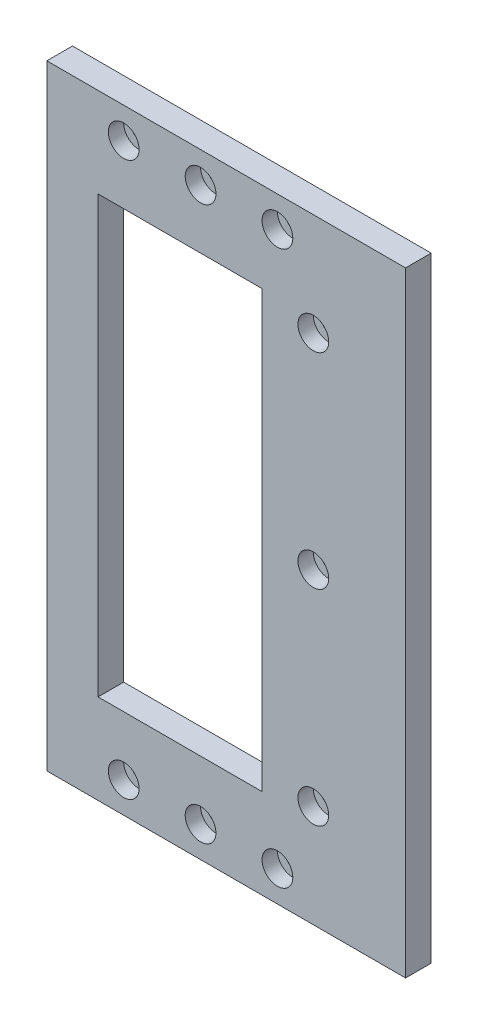
ISO-10303-21;
HEADER;
FILE_DESCRIPTION(('STEP AP214'),'2;1');
FILE_NAME('part.step','',(''),(''),'','','');
FILE_SCHEMA(('AUTOMOTIVE_DESIGN { 1 0 10303 214 1 1 1 1 }'));
ENDSEC;
DATA;
#1=APPLICATION_CONTEXT('core data for automotive mechanical design processes');
#2=APPLICATION_PROTOCOL_DEFINITION('international standard','automotive_design',2000,#1);
#3=PRODUCT_CONTEXT('',#1,'mechanical');
#4=PRODUCT('Part','Part','',(#3));
#5=PRODUCT_RELATED_PRODUCT_CATEGORY('part','',(#4));
#6=PRODUCT_DEFINITION_FORMATION('','',#4);
#7=PRODUCT_DEFINITION_CONTEXT('part definition',#1,'design');
#8=PRODUCT_DEFINITION('design','',#6,#7);
#9=PRODUCT_DEFINITION_SHAPE('','',#8);
#10=(LENGTH_UNIT() NAMED_UNIT(*) SI_UNIT(.MILLI.,.METRE.));
#11=(NAMED_UNIT(*) PLANE_ANGLE_UNIT() SI_UNIT($,.RADIAN.));
#12=(NAMED_UNIT(*) SI_UNIT($,.STERADIAN.) SOLID_ANGLE_UNIT());
#13=UNCERTAINTY_MEASURE_WITH_UNIT(LENGTH_MEASURE(1.E-05),#10,'distance_accuracy_value','');
#14=(GEOMETRIC_REPRESENTATION_CONTEXT(3) GLOBAL_UNCERTAINTY_ASSIGNED_CONTEXT((#13)) GLOBAL_UNIT_ASSIGNED_CONTEXT((#10,
#11,#12)) REPRESENTATION_CONTEXT('',''));
#15=CARTESIAN_POINT('',(0.,0.,0.));
#16=DIRECTION('',(0.,0.,1.));
#17=DIRECTION('',(1.,0.,0.));
#18=AXIS2_PLACEMENT_3D('',#15,#16,#17);
#19=CARTESIAN_POINT('',(-30.,60.,5.));
#20=DIRECTION('',(1.,0.,0.));
#21=DIRECTION('',(0.,0.,-1.));
#22=AXIS2_PLACEMENT_3D('',#19,#20,#21);
#23=PLANE('',#22);
#24=DIRECTION('',(0.,-1.,0.));
#25=VECTOR('',#24,1.);
#26=CARTESIAN_POINT('',(-30.,60.,0.));
#27=LINE('',#26,#25);
#28=CARTESIAN_POINT('',(-30.,60.,0.));
#29=VERTEX_POINT('',#28);
#30=CARTESIAN_POINT('',(-30.,-60.,0.));
#31=VERTEX_POINT('',#30);
#32=EDGE_CURVE('E240',#29,#31,#27,.T.);
#33=ORIENTED_EDGE('',*,*,#32,.T.);
#34=DIRECTION('',(0.,0.,-1.));
#35=VECTOR('',#34,1.);
#36=CARTESIAN_POINT('',(-30.,-60.,5.));
#37=LINE('',#36,#35);
#38=CARTESIAN_POINT('',(-30.,-60.,5.));
#39=VERTEX_POINT('',#38);
#40=EDGE_CURVE('E44',#39,#31,#37,.T.);
#41=ORIENTED_EDGE('',*,*,#40,.F.);
#42=DIRECTION('',(0.,-1.,0.));
#43=VECTOR('',#42,1.);
#44=CARTESIAN_POINT('',(-30.,60.,5.));
#45=LINE('',#44,#43);
#46=CARTESIAN_POINT('',(-30.,60.,5.));
#47=VERTEX_POINT('',#46);
#48=EDGE_CURVE('E230',#47,#39,#45,.T.);
#49=ORIENTED_EDGE('',*,*,#48,.F.);
#50=DIRECTION('',(0.,0.,-1.));
#51=VECTOR('',#50,1.);
#52=CARTESIAN_POINT('',(-30.,60.,5.));
#53=LINE('',#52,#51);
#54=EDGE_CURVE('E11',#47,#29,#53,.T.);
#55=ORIENTED_EDGE('',*,*,#54,.T.);
#56=EDGE_LOOP('',(#33,#41,#49,#55));
#57=FACE_BOUND('',#56,.T.);
#58=ADVANCED_FACE('F36',(#57),#23,.F.);
#59=CARTESIAN_POINT('',(0.,-60.,5.));
#60=DIRECTION('',(0.,1.,0.));
#61=DIRECTION('',(0.,0.,1.));
#62=AXIS2_PLACEMENT_3D('',#59,#60,#61);
#63=PLANE('',#62);
#64=DIRECTION('',(1.,0.,0.));
#65=VECTOR('',#64,1.);
#66=CARTESIAN_POINT('',(0.,-60.,0.));
#67=LINE('',#66,#65);
#68=CARTESIAN_POINT('',(40.,-60.,0.));
#69=VERTEX_POINT('',#68);
#70=EDGE_CURVE('E243',#31,#69,#67,.T.);
#71=ORIENTED_EDGE('',*,*,#70,.T.);
#72=DIRECTION('',(0.,0.,-1.));
#73=VECTOR('',#72,1.);
#74=CARTESIAN_POINT('',(40.,-60.,5.));
#75=LINE('',#74,#73);
#76=CARTESIAN_POINT('',(40.,-60.,5.));
#77=VERTEX_POINT('',#76);
#78=EDGE_CURVE('E252',#77,#69,#75,.T.);
#79=ORIENTED_EDGE('',*,*,#78,.F.);
#80=DIRECTION('',(-1.,0.,0.));
#81=VECTOR('',#80,1.);
#82=CARTESIAN_POINT('',(0.,-60.,5.));
#83=LINE('',#82,#81);
#84=EDGE_CURVE('E233',#77,#39,#83,.T.);
#85=ORIENTED_EDGE('',*,*,#84,.T.);
#86=ORIENTED_EDGE('',*,*,#40,.T.);
#87=EDGE_LOOP('',(#71,#79,#85,#86));
#88=FACE_BOUND('',#87,.T.);
#89=ADVANCED_FACE('F291',(#88),#63,.F.);
#90=CARTESIAN_POINT('',(40.,60.,5.));
#91=DIRECTION('',(1.,0.,0.));
#92=DIRECTION('',(0.,1.,0.));
#93=AXIS2_PLACEMENT_3D('',#90,#91,#92);
#94=PLANE('',#93);
#95=DIRECTION('',(0.,-1.,0.));
#96=VECTOR('',#95,1.);
#97=CARTESIAN_POINT('',(40.,60.,0.));
#98=LINE('',#97,#96);
#99=CARTESIAN_POINT('',(40.,60.,0.));
#100=VERTEX_POINT('',#99);
#101=EDGE_CURVE('E246',#100,#69,#98,.T.);
#102=ORIENTED_EDGE('',*,*,#101,.F.);
#103=DIRECTION('',(0.,0.,-1.));
#104=VECTOR('',#103,1.);
#105=CARTESIAN_POINT('',(40.,60.,5.));
#106=LINE('',#105,#104);
#107=CARTESIAN_POINT('',(40.,60.,5.));
#108=VERTEX_POINT('',#107);
#109=EDGE_CURVE('E239',#108,#100,#106,.T.);
#110=ORIENTED_EDGE('',*,*,#109,.F.);
#111=DIRECTION('',(0.,-1.,0.));
#112=VECTOR('',#111,1.);
#113=CARTESIAN_POINT('',(40.,60.,5.));
#114=LINE('',#113,#112);
#115=EDGE_CURVE('E236',#108,#77,#114,.T.);
#116=ORIENTED_EDGE('',*,*,#115,.T.);
#117=ORIENTED_EDGE('',*,*,#78,.T.);
#118=EDGE_LOOP('',(#102,#110,#116,#117));
#119=FACE_BOUND('',#118,.T.);
#120=ADVANCED_FACE('F296',(#119),#94,.T.);
#121=CARTESIAN_POINT('',(0.,60.,5.));
#122=DIRECTION('',(0.,1.,0.));
#123=DIRECTION('',(0.,0.,1.));
#124=AXIS2_PLACEMENT_3D('',#121,#122,#123);
#125=PLANE('',#124);
#126=DIRECTION('',(1.,0.,0.));
#127=VECTOR('',#126,1.);
#128=CARTESIAN_POINT('',(0.,60.,0.));
#129=LINE('',#128,#127);
#130=EDGE_CURVE('E231',#29,#100,#129,.T.);
#131=ORIENTED_EDGE('',*,*,#130,.F.);
#132=ORIENTED_EDGE('',*,*,#54,.F.);
#133=DIRECTION('',(-1.,0.,0.));
#134=VECTOR('',#133,1.);
#135=CARTESIAN_POINT('',(0.,60.,5.));
#136=LINE('',#135,#134);
#137=EDGE_CURVE('E227',#108,#47,#136,.T.);
#138=ORIENTED_EDGE('',*,*,#137,.F.);
#139=ORIENTED_EDGE('',*,*,#109,.T.);
#140=EDGE_LOOP('',(#131,#132,#138,#139));
#141=FACE_BOUND('',#140,.T.);
#142=ADVANCED_FACE('F309',(#141),#125,.T.);
#143=CARTESIAN_POINT('',(0.,0.,5.));
#144=DIRECTION('',(0.,0.,1.));
#145=DIRECTION('',(1.,0.,0.));
#146=AXIS2_PLACEMENT_3D('',#143,#144,#145);
#147=PLANE('',#146);
#148=DIRECTION('',(0.,1.,0.));
#149=VECTOR('',#148,1.);
#150=CARTESIAN_POINT('',(12.,-42.5,5.));
#151=LINE('',#150,#149);
#152=CARTESIAN_POINT('',(12.,-42.5,5.));
#153=VERTEX_POINT('',#152);
#154=CARTESIAN_POINT('',(12.,42.5,5.));
#155=VERTEX_POINT('',#154);
#156=EDGE_CURVE('E52',#153,#155,#151,.T.);
#157=ORIENTED_EDGE('',*,*,#156,.F.);
#158=DIRECTION('',(1.,0.,0.));
#159=VECTOR('',#158,1.);
#160=CARTESIAN_POINT('',(-20.,-42.5,5.));
#161=LINE('',#160,#159);
#162=CARTESIAN_POINT('',(-20.,-42.5,5.));
#163=VERTEX_POINT('',#162);
#164=EDGE_CURVE('E120',#163,#153,#161,.T.);
#165=ORIENTED_EDGE('',*,*,#164,.F.);
#166=DIRECTION('',(0.,-1.,0.));
#167=VECTOR('',#166,1.);
#168=CARTESIAN_POINT('',(-20.,-42.5,5.));
#169=LINE('',#168,#167);
#170=CARTESIAN_POINT('',(-20.,42.5,5.));
#171=VERTEX_POINT('',#170);
#172=EDGE_CURVE('E123',#171,#163,#169,.T.);
#173=ORIENTED_EDGE('',*,*,#172,.F.);
#174=DIRECTION('',(-1.,0.,0.));
#175=VECTOR('',#174,1.);
#176=CARTESIAN_POINT('',(-20.,42.5,5.));
#177=LINE('',#176,#175);
#178=EDGE_CURVE('E129',#155,#171,#177,.T.);
#179=ORIENTED_EDGE('',*,*,#178,.F.);
#180=EDGE_LOOP('',(#157,#165,#173,#179));
#181=FACE_BOUND('',#180,.T.);
#182=CARTESIAN_POINT('',(-15.,54.,5.));
#183=DIRECTION('',(0.,0.,1.));
#184=DIRECTION('',(1.,0.,0.));
#185=AXIS2_PLACEMENT_3D('',#182,#183,#184);
#186=CIRCLE('',#185,3.00000000000001);
#187=CARTESIAN_POINT('',(-12.,54.,5.));
#188=VERTEX_POINT('',#187);
#189=EDGE_CURVE('E135',#188,#188,#186,.T.);
#190=ORIENTED_EDGE('',*,*,#189,.F.);
#191=EDGE_LOOP('',(#190));
#192=FACE_BOUND('',#191,.T.);
#193=CARTESIAN_POINT('',(0.,54.,5.));
#194=DIRECTION('',(0.,0.,1.));
#195=DIRECTION('',(1.,0.,0.));
#196=AXIS2_PLACEMENT_3D('',#193,#194,#195);
#197=CIRCLE('',#196,3.00000000000001);
#198=CARTESIAN_POINT('',(3.00000000000001,54.,5.));
#199=VERTEX_POINT('',#198);
#200=EDGE_CURVE('E147',#199,#199,#197,.T.);
#201=ORIENTED_EDGE('',*,*,#200,.F.);
#202=EDGE_LOOP('',(#201));
#203=FACE_BOUND('',#202,.T.);
#204=CARTESIAN_POINT('',(15.,54.,5.));
#205=DIRECTION('',(0.,0.,1.));
#206=DIRECTION('',(1.,0.,0.));
#207=AXIS2_PLACEMENT_3D('',#204,#205,#206);
#208=CIRCLE('',#207,3.00000000000001);
#209=CARTESIAN_POINT('',(18.,54.,5.));
#210=VERTEX_POINT('',#209);
#211=EDGE_CURVE('E157',#210,#210,#208,.T.);
#212=ORIENTED_EDGE('',*,*,#211,.F.);
#213=EDGE_LOOP('',(#212));
#214=FACE_BOUND('',#213,.T.);
#215=CARTESIAN_POINT('',(22.,40.,5.));
#216=DIRECTION('',(0.,0.,1.));
#217=DIRECTION('',(1.,0.,0.));
#218=AXIS2_PLACEMENT_3D('',#215,#216,#217);
#219=CIRCLE('',#218,3.00000000000001);
#220=CARTESIAN_POINT('',(25.,40.,5.));
#221=VERTEX_POINT('',#220);
#222=EDGE_CURVE('E167',#221,#221,#219,.T.);
#223=ORIENTED_EDGE('',*,*,#222,.F.);
#224=EDGE_LOOP('',(#223));
#225=FACE_BOUND('',#224,.T.);
#226=CARTESIAN_POINT('',(22.,-40.,5.));
#227=DIRECTION('',(0.,0.,1.));
#228=DIRECTION('',(1.,0.,0.));
#229=AXIS2_PLACEMENT_3D('',#226,#227,#228);
#230=CIRCLE('',#229,3.00000000000001);
#231=CARTESIAN_POINT('',(25.,-40.,5.));
#232=VERTEX_POINT('',#231);
#233=EDGE_CURVE('E177',#232,#232,#230,.T.);
#234=ORIENTED_EDGE('',*,*,#233,.F.);
#235=EDGE_LOOP('',(#234));
#236=FACE_BOUND('',#235,.T.);
#237=CARTESIAN_POINT('',(15.,-54.,5.));
#238=DIRECTION('',(0.,0.,1.));
#239=DIRECTION('',(1.,0.,0.));
#240=AXIS2_PLACEMENT_3D('',#237,#238,#239);
#241=CIRCLE('',#240,3.00000000000001);
#242=CARTESIAN_POINT('',(18.,-54.,5.));
#243=VERTEX_POINT('',#242);
#244=EDGE_CURVE('E187',#243,#243,#241,.T.);
#245=ORIENTED_EDGE('',*,*,#244,.F.);
#246=EDGE_LOOP('',(#245));
#247=FACE_BOUND('',#246,.T.);
#248=CARTESIAN_POINT('',(0.,-54.,5.));
#249=DIRECTION('',(0.,0.,1.));
#250=DIRECTION('',(1.,0.,0.));
#251=AXIS2_PLACEMENT_3D('',#248,#249,#250);
#252=CIRCLE('',#251,3.00000000000001);
#253=CARTESIAN_POINT('',(3.00000000000001,-54.,5.));
#254=VERTEX_POINT('',#253);
#255=EDGE_CURVE('E197',#254,#254,#252,.T.);
#256=ORIENTED_EDGE('',*,*,#255,.F.);
#257=EDGE_LOOP('',(#256));
#258=FACE_BOUND('',#257,.T.);
#259=CARTESIAN_POINT('',(-15.,-54.,5.));
#260=DIRECTION('',(0.,0.,1.));
#261=DIRECTION('',(1.,0.,0.));
#262=AXIS2_PLACEMENT_3D('',#259,#260,#261);
#263=CIRCLE('',#262,3.00000000000001);
#264=CARTESIAN_POINT('',(-12.,-54.,5.));
#265=VERTEX_POINT('',#264);
#266=EDGE_CURVE('E207',#265,#265,#263,.T.);
#267=ORIENTED_EDGE('',*,*,#266,.F.);
#268=EDGE_LOOP('',(#267));
#269=FACE_BOUND('',#268,.T.);
#270=CARTESIAN_POINT('',(22.,0.,5.));
#271=DIRECTION('',(0.,0.,1.));
#272=DIRECTION('',(1.,0.,0.));
#273=AXIS2_PLACEMENT_3D('',#270,#271,#272);
#274=CIRCLE('',#273,3.00000000000001);
#275=CARTESIAN_POINT('',(25.,0.,5.));
#276=VERTEX_POINT('',#275);
#277=EDGE_CURVE('E217',#276,#276,#274,.T.);
#278=ORIENTED_EDGE('',*,*,#277,.F.);
#279=EDGE_LOOP('',(#278));
#280=FACE_BOUND('',#279,.T.);
#281=ORIENTED_EDGE('',*,*,#137,.T.);
#282=ORIENTED_EDGE('',*,*,#48,.T.);
#283=ORIENTED_EDGE('',*,*,#84,.F.);
#284=ORIENTED_EDGE('',*,*,#115,.F.);
#285=EDGE_LOOP('',(#281,#282,#283,#284));
#286=FACE_BOUND('',#285,.T.);
#287=ADVANCED_FACE('F306',(#181,#192,#203,#214,#225,#236,#247,#258,#269,#280,#286),#147,.T.);
#288=CARTESIAN_POINT('',(0.,0.,0.));
#289=DIRECTION('',(0.,0.,1.));
#290=DIRECTION('',(1.,0.,0.));
#291=AXIS2_PLACEMENT_3D('',#288,#289,#290);
#292=PLANE('',#291);
#293=DIRECTION('',(1.,0.,0.));
#294=VECTOR('',#293,1.);
#295=CARTESIAN_POINT('',(-20.,-42.5,0.));
#296=LINE('',#295,#294);
#297=CARTESIAN_POINT('',(-20.,-42.5,0.));
#298=VERTEX_POINT('',#297);
#299=CARTESIAN_POINT('',(12.,-42.5,0.));
#300=VERTEX_POINT('',#299);
#301=EDGE_CURVE('E110',#298,#300,#296,.T.);
#302=ORIENTED_EDGE('',*,*,#301,.T.);
#303=DIRECTION('',(0.,1.,0.));
#304=VECTOR('',#303,1.);
#305=CARTESIAN_POINT('',(12.,-42.5,0.));
#306=LINE('',#305,#304);
#307=CARTESIAN_POINT('',(12.,42.5,0.));
#308=VERTEX_POINT('',#307);
#309=EDGE_CURVE('E104',#300,#308,#306,.T.);
#310=ORIENTED_EDGE('',*,*,#309,.T.);
#311=DIRECTION('',(-1.,0.,0.));
#312=VECTOR('',#311,1.);
#313=CARTESIAN_POINT('',(-20.,42.5,0.));
#314=LINE('',#313,#312);
#315=CARTESIAN_POINT('',(-20.,42.5,0.));
#316=VERTEX_POINT('',#315);
#317=EDGE_CURVE('E113',#308,#316,#314,.T.);
#318=ORIENTED_EDGE('',*,*,#317,.T.);
#319=DIRECTION('',(0.,-1.,0.));
#320=VECTOR('',#319,1.);
#321=CARTESIAN_POINT('',(-20.,-42.5,0.));
#322=LINE('',#321,#320);
#323=EDGE_CURVE('E60',#316,#298,#322,.T.);
#324=ORIENTED_EDGE('',*,*,#323,.T.);
#325=EDGE_LOOP('',(#302,#310,#318,#324));
#326=FACE_BOUND('',#325,.T.);
#327=CARTESIAN_POINT('',(-15.,54.,0.));
#328=DIRECTION('',(0.,0.,1.));
#329=DIRECTION('',(1.,0.,0.));
#330=AXIS2_PLACEMENT_3D('',#327,#328,#329);
#331=CIRCLE('',#330,1.30000000000001);
#332=CARTESIAN_POINT('',(-13.7,54.,0.));
#333=VERTEX_POINT('',#332);
#334=EDGE_CURVE('E39',#333,#333,#331,.T.);
#335=ORIENTED_EDGE('',*,*,#334,.T.);
#336=EDGE_LOOP('',(#335));
#337=FACE_BOUND('',#336,.T.);
#338=CARTESIAN_POINT('',(0.,54.,0.));
#339=DIRECTION('',(0.,0.,1.));
#340=DIRECTION('',(1.,0.,0.));
#341=AXIS2_PLACEMENT_3D('',#338,#339,#340);
#342=CIRCLE('',#341,1.30000000000001);
#343=CARTESIAN_POINT('',(1.30000000000001,54.,0.));
#344=VERTEX_POINT('',#343);
#345=EDGE_CURVE('E156',#344,#344,#342,.T.);
#346=ORIENTED_EDGE('',*,*,#345,.T.);
#347=EDGE_LOOP('',(#346));
#348=FACE_BOUND('',#347,.T.);
#349=CARTESIAN_POINT('',(15.,54.,0.));
#350=DIRECTION('',(0.,0.,1.));
#351=DIRECTION('',(1.,0.,0.));
#352=AXIS2_PLACEMENT_3D('',#349,#350,#351);
#353=CIRCLE('',#352,1.30000000000001);
#354=CARTESIAN_POINT('',(16.3,54.,0.));
#355=VERTEX_POINT('',#354);
#356=EDGE_CURVE('E166',#355,#355,#353,.T.);
#357=ORIENTED_EDGE('',*,*,#356,.T.);
#358=EDGE_LOOP('',(#357));
#359=FACE_BOUND('',#358,.T.);
#360=CARTESIAN_POINT('',(22.,40.,0.));
#361=DIRECTION('',(0.,0.,1.));
#362=DIRECTION('',(1.,0.,0.));
#363=AXIS2_PLACEMENT_3D('',#360,#361,#362);
#364=CIRCLE('',#363,1.30000000000001);
#365=CARTESIAN_POINT('',(23.3,40.,0.));
#366=VERTEX_POINT('',#365);
#367=EDGE_CURVE('E176',#366,#366,#364,.T.);
#368=ORIENTED_EDGE('',*,*,#367,.T.);
#369=EDGE_LOOP('',(#368));
#370=FACE_BOUND('',#369,.T.);
#371=CARTESIAN_POINT('',(22.,-40.,0.));
#372=DIRECTION('',(0.,0.,1.));
#373=DIRECTION('',(1.,0.,0.));
#374=AXIS2_PLACEMENT_3D('',#371,#372,#373);
#375=CIRCLE('',#374,1.30000000000001);
#376=CARTESIAN_POINT('',(23.3,-40.,0.));
#377=VERTEX_POINT('',#376);
#378=EDGE_CURVE('E186',#377,#377,#375,.T.);
#379=ORIENTED_EDGE('',*,*,#378,.T.);
#380=EDGE_LOOP('',(#379));
#381=FACE_BOUND('',#380,.T.);
#382=CARTESIAN_POINT('',(15.,-54.,0.));
#383=DIRECTION('',(0.,0.,1.));
#384=DIRECTION('',(1.,0.,0.));
#385=AXIS2_PLACEMENT_3D('',#382,#383,#384);
#386=CIRCLE('',#385,1.30000000000001);
#387=CARTESIAN_POINT('',(16.3,-54.,0.));
#388=VERTEX_POINT('',#387);
#389=EDGE_CURVE('E196',#388,#388,#386,.T.);
#390=ORIENTED_EDGE('',*,*,#389,.T.);
#391=EDGE_LOOP('',(#390));
#392=FACE_BOUND('',#391,.T.);
#393=CARTESIAN_POINT('',(0.,-54.,0.));
#394=DIRECTION('',(0.,0.,1.));
#395=DIRECTION('',(1.,0.,0.));
#396=AXIS2_PLACEMENT_3D('',#393,#394,#395);
#397=CIRCLE('',#396,1.30000000000001);
#398=CARTESIAN_POINT('',(1.30000000000001,-54.,0.));
#399=VERTEX_POINT('',#398);
#400=EDGE_CURVE('E206',#399,#399,#397,.T.);
#401=ORIENTED_EDGE('',*,*,#400,.T.);
#402=EDGE_LOOP('',(#401));
#403=FACE_BOUND('',#402,.T.);
#404=CARTESIAN_POINT('',(-15.,-54.,0.));
#405=DIRECTION('',(0.,0.,1.));
#406=DIRECTION('',(1.,0.,0.));
#407=AXIS2_PLACEMENT_3D('',#404,#405,#406);
#408=CIRCLE('',#407,1.30000000000001);
#409=CARTESIAN_POINT('',(-13.7,-54.,0.));
#410=VERTEX_POINT('',#409);
#411=EDGE_CURVE('E216',#410,#410,#408,.T.);
#412=ORIENTED_EDGE('',*,*,#411,.T.);
#413=EDGE_LOOP('',(#412));
#414=FACE_BOUND('',#413,.T.);
#415=CARTESIAN_POINT('',(22.,0.,0.));
#416=DIRECTION('',(0.,0.,1.));
#417=DIRECTION('',(1.,0.,0.));
#418=AXIS2_PLACEMENT_3D('',#415,#416,#417);
#419=CIRCLE('',#418,1.30000000000001);
#420=CARTESIAN_POINT('',(23.3,0.,0.));
#421=VERTEX_POINT('',#420);
#422=EDGE_CURVE('E226',#421,#421,#419,.T.);
#423=ORIENTED_EDGE('',*,*,#422,.T.);
#424=EDGE_LOOP('',(#423));
#425=FACE_BOUND('',#424,.T.);
#426=ORIENTED_EDGE('',*,*,#32,.F.);
#427=ORIENTED_EDGE('',*,*,#130,.T.);
#428=ORIENTED_EDGE('',*,*,#101,.T.);
#429=ORIENTED_EDGE('',*,*,#70,.F.);
#430=EDGE_LOOP('',(#426,#427,#428,#429));
#431=FACE_BOUND('',#430,.T.);
#432=ADVANCED_FACE('F117',(#326,#337,#348,#359,#370,#381,#392,#403,#414,#425,#431),#292,.F.);
#433=CARTESIAN_POINT('',(22.,0.,5.));
#434=DIRECTION('',(0.,0.,1.));
#435=DIRECTION('',(1.,0.,0.));
#436=AXIS2_PLACEMENT_3D('',#433,#434,#435);
#437=CYLINDRICAL_SURFACE('',#436,1.30000000000001);
#438=CARTESIAN_POINT('',(22.,0.,2.));
#439=DIRECTION('',(0.,0.,1.));
#440=DIRECTION('',(1.,0.,0.));
#441=AXIS2_PLACEMENT_3D('',#438,#439,#440);
#442=CIRCLE('',#441,1.30000000000001);
#443=CARTESIAN_POINT('',(23.3,0.,2.));
#444=VERTEX_POINT('',#443);
#445=EDGE_CURVE('E223',#444,#444,#442,.T.);
#446=ORIENTED_EDGE('',*,*,#445,.T.);
#447=EDGE_LOOP('',(#446));
#448=FACE_BOUND('',#447,.T.);
#449=ORIENTED_EDGE('',*,*,#422,.F.);
#450=EDGE_LOOP('',(#449));
#451=FACE_BOUND('',#450,.T.);
#452=ADVANCED_FACE('F320',(#448,#451),#437,.F.);
#453=CARTESIAN_POINT('',(23.3,0.,2.));
#454=DIRECTION('',(0.,0.,-1.));
#455=DIRECTION('',(-1.,0.,0.));
#456=AXIS2_PLACEMENT_3D('',#453,#454,#455);
#457=PLANE('',#456);
#458=ORIENTED_EDGE('',*,*,#445,.F.);
#459=EDGE_LOOP('',(#458));
#460=FACE_BOUND('',#459,.T.);
#461=CARTESIAN_POINT('',(22.,0.,2.));
#462=DIRECTION('',(0.,0.,1.));
#463=DIRECTION('',(1.,0.,0.));
#464=AXIS2_PLACEMENT_3D('',#461,#462,#463);
#465=CIRCLE('',#464,3.00000000000001);
#466=CARTESIAN_POINT('',(25.,0.,2.));
#467=VERTEX_POINT('',#466);
#468=EDGE_CURVE('E220',#467,#467,#465,.T.);
#469=ORIENTED_EDGE('',*,*,#468,.T.);
#470=EDGE_LOOP('',(#469));
#471=FACE_BOUND('',#470,.T.);
#472=ADVANCED_FACE('F326',(#460,#471),#457,.F.);
#473=CARTESIAN_POINT('',(22.,0.,5.));
#474=DIRECTION('',(0.,0.,1.));
#475=DIRECTION('',(1.,0.,0.));
#476=AXIS2_PLACEMENT_3D('',#473,#474,#475);
#477=CYLINDRICAL_SURFACE('',#476,3.00000000000001);
#478=ORIENTED_EDGE('',*,*,#468,.F.);
#479=EDGE_LOOP('',(#478));
#480=FACE_BOUND('',#479,.T.);
#481=ORIENTED_EDGE('',*,*,#277,.T.);
#482=EDGE_LOOP('',(#481));
#483=FACE_BOUND('',#482,.T.);
#484=ADVANCED_FACE('F330',(#480,#483),#477,.F.);
#485=CARTESIAN_POINT('',(-15.,-54.,5.));
#486=DIRECTION('',(0.,0.,1.));
#487=DIRECTION('',(1.,0.,0.));
#488=AXIS2_PLACEMENT_3D('',#485,#486,#487);
#489=CYLINDRICAL_SURFACE('',#488,1.30000000000001);
#490=CARTESIAN_POINT('',(-15.,-54.,2.));
#491=DIRECTION('',(0.,0.,1.));
#492=DIRECTION('',(1.,0.,0.));
#493=AXIS2_PLACEMENT_3D('',#490,#491,#492);
#494=CIRCLE('',#493,1.30000000000001);
#495=CARTESIAN_POINT('',(-13.7,-54.,2.));
#496=VERTEX_POINT('',#495);
#497=EDGE_CURVE('E213',#496,#496,#494,.T.);
#498=ORIENTED_EDGE('',*,*,#497,.T.);
#499=EDGE_LOOP('',(#498));
#500=FACE_BOUND('',#499,.T.);
#501=ORIENTED_EDGE('',*,*,#411,.F.);
#502=EDGE_LOOP('',(#501));
#503=FACE_BOUND('',#502,.T.);
#504=ADVANCED_FACE('F334',(#500,#503),#489,.F.);
#505=CARTESIAN_POINT('',(-13.7,-54.,2.));
#506=DIRECTION('',(0.,0.,-1.));
#507=DIRECTION('',(-1.,0.,0.));
#508=AXIS2_PLACEMENT_3D('',#505,#506,#507);
#509=PLANE('',#508);
#510=ORIENTED_EDGE('',*,*,#497,.F.);
#511=EDGE_LOOP('',(#510));
#512=FACE_BOUND('',#511,.T.);
#513=CARTESIAN_POINT('',(-15.,-54.,2.));
#514=DIRECTION('',(0.,0.,1.));
#515=DIRECTION('',(1.,0.,0.));
#516=AXIS2_PLACEMENT_3D('',#513,#514,#515);
#517=CIRCLE('',#516,3.00000000000001);
#518=CARTESIAN_POINT('',(-12.,-54.,2.));
#519=VERTEX_POINT('',#518);
#520=EDGE_CURVE('E210',#519,#519,#517,.T.);
#521=ORIENTED_EDGE('',*,*,#520,.T.);
#522=EDGE_LOOP('',(#521));
#523=FACE_BOUND('',#522,.T.);
#524=ADVANCED_FACE('F338',(#512,#523),#509,.F.);
#525=CARTESIAN_POINT('',(-15.,-54.,5.));
#526=DIRECTION('',(0.,0.,1.));
#527=DIRECTION('',(1.,0.,0.));
#528=AXIS2_PLACEMENT_3D('',#525,#526,#527);
#529=CYLINDRICAL_SURFACE('',#528,3.00000000000001);
#530=ORIENTED_EDGE('',*,*,#520,.F.);
#531=EDGE_LOOP('',(#530));
#532=FACE_BOUND('',#531,.T.);
#533=ORIENTED_EDGE('',*,*,#266,.T.);
#534=EDGE_LOOP('',(#533));
#535=FACE_BOUND('',#534,.T.);
#536=ADVANCED_FACE('F342',(#532,#535),#529,.F.);
#537=CARTESIAN_POINT('',(0.,-54.,5.));
#538=DIRECTION('',(0.,0.,1.));
#539=DIRECTION('',(1.,0.,0.));
#540=AXIS2_PLACEMENT_3D('',#537,#538,#539);
#541=CYLINDRICAL_SURFACE('',#540,1.30000000000001);
#542=CARTESIAN_POINT('',(0.,-54.,2.));
#543=DIRECTION('',(0.,0.,1.));
#544=DIRECTION('',(1.,0.,0.));
#545=AXIS2_PLACEMENT_3D('',#542,#543,#544);
#546=CIRCLE('',#545,1.30000000000001);
#547=CARTESIAN_POINT('',(1.30000000000001,-54.,2.));
#548=VERTEX_POINT('',#547);
#549=EDGE_CURVE('E203',#548,#548,#546,.T.);
#550=ORIENTED_EDGE('',*,*,#549,.T.);
#551=EDGE_LOOP('',(#550));
#552=FACE_BOUND('',#551,.T.);
#553=ORIENTED_EDGE('',*,*,#400,.F.);
#554=EDGE_LOOP('',(#553));
#555=FACE_BOUND('',#554,.T.);
#556=ADVANCED_FACE('F346',(#552,#555),#541,.F.);
#557=CARTESIAN_POINT('',(1.30000000000001,-54.,2.));
#558=DIRECTION('',(0.,0.,-1.));
#559=DIRECTION('',(-1.,0.,0.));
#560=AXIS2_PLACEMENT_3D('',#557,#558,#559);
#561=PLANE('',#560);
#562=ORIENTED_EDGE('',*,*,#549,.F.);
#563=EDGE_LOOP('',(#562));
#564=FACE_BOUND('',#563,.T.);
#565=CARTESIAN_POINT('',(0.,-54.,2.));
#566=DIRECTION('',(0.,0.,1.));
#567=DIRECTION('',(1.,0.,0.));
#568=AXIS2_PLACEMENT_3D('',#565,#566,#567);
#569=CIRCLE('',#568,3.00000000000001);
#570=CARTESIAN_POINT('',(3.00000000000001,-54.,2.));
#571=VERTEX_POINT('',#570);
#572=EDGE_CURVE('E200',#571,#571,#569,.T.);
#573=ORIENTED_EDGE('',*,*,#572,.T.);
#574=EDGE_LOOP('',(#573));
#575=FACE_BOUND('',#574,.T.);
#576=ADVANCED_FACE('F350',(#564,#575),#561,.F.);
#577=CARTESIAN_POINT('',(0.,-54.,5.));
#578=DIRECTION('',(0.,0.,1.));
#579=DIRECTION('',(1.,0.,0.));
#580=AXIS2_PLACEMENT_3D('',#577,#578,#579);
#581=CYLINDRICAL_SURFACE('',#580,3.00000000000001);
#582=ORIENTED_EDGE('',*,*,#572,.F.);
#583=EDGE_LOOP('',(#582));
#584=FACE_BOUND('',#583,.T.);
#585=ORIENTED_EDGE('',*,*,#255,.T.);
#586=EDGE_LOOP('',(#585));
#587=FACE_BOUND('',#586,.T.);
#588=ADVANCED_FACE('F354',(#584,#587),#581,.F.);
#589=CARTESIAN_POINT('',(15.,-54.,5.));
#590=DIRECTION('',(0.,0.,1.));
#591=DIRECTION('',(1.,0.,0.));
#592=AXIS2_PLACEMENT_3D('',#589,#590,#591);
#593=CYLINDRICAL_SURFACE('',#592,1.30000000000001);
#594=CARTESIAN_POINT('',(15.,-54.,2.));
#595=DIRECTION('',(0.,0.,1.));
#596=DIRECTION('',(1.,0.,0.));
#597=AXIS2_PLACEMENT_3D('',#594,#595,#596);
#598=CIRCLE('',#597,1.30000000000001);
#599=CARTESIAN_POINT('',(16.3,-54.,2.));
#600=VERTEX_POINT('',#599);
#601=EDGE_CURVE('E193',#600,#600,#598,.T.);
#602=ORIENTED_EDGE('',*,*,#601,.T.);
#603=EDGE_LOOP('',(#602));
#604=FACE_BOUND('',#603,.T.);
#605=ORIENTED_EDGE('',*,*,#389,.F.);
#606=EDGE_LOOP('',(#605));
#607=FACE_BOUND('',#606,.T.);
#608=ADVANCED_FACE('F358',(#604,#607),#593,.F.);
#609=CARTESIAN_POINT('',(16.3,-54.,2.));
#610=DIRECTION('',(0.,0.,-1.));
#611=DIRECTION('',(-1.,0.,0.));
#612=AXIS2_PLACEMENT_3D('',#609,#610,#611);
#613=PLANE('',#612);
#614=ORIENTED_EDGE('',*,*,#601,.F.);
#615=EDGE_LOOP('',(#614));
#616=FACE_BOUND('',#615,.T.);
#617=CARTESIAN_POINT('',(15.,-54.,2.));
#618=DIRECTION('',(0.,0.,1.));
#619=DIRECTION('',(1.,0.,0.));
#620=AXIS2_PLACEMENT_3D('',#617,#618,#619);
#621=CIRCLE('',#620,3.00000000000001);
#622=CARTESIAN_POINT('',(18.,-54.,2.));
#623=VERTEX_POINT('',#622);
#624=EDGE_CURVE('E190',#623,#623,#621,.T.);
#625=ORIENTED_EDGE('',*,*,#624,.T.);
#626=EDGE_LOOP('',(#625));
#627=FACE_BOUND('',#626,.T.);
#628=ADVANCED_FACE('F362',(#616,#627),#613,.F.);
#629=CARTESIAN_POINT('',(15.,-54.,5.));
#630=DIRECTION('',(0.,0.,1.));
#631=DIRECTION('',(1.,0.,0.));
#632=AXIS2_PLACEMENT_3D('',#629,#630,#631);
#633=CYLINDRICAL_SURFACE('',#632,3.00000000000001);
#634=ORIENTED_EDGE('',*,*,#624,.F.);
#635=EDGE_LOOP('',(#634));
#636=FACE_BOUND('',#635,.T.);
#637=ORIENTED_EDGE('',*,*,#244,.T.);
#638=EDGE_LOOP('',(#637));
#639=FACE_BOUND('',#638,.T.);
#640=ADVANCED_FACE('F366',(#636,#639),#633,.F.);
#641=CARTESIAN_POINT('',(22.,-40.,5.));
#642=DIRECTION('',(0.,0.,1.));
#643=DIRECTION('',(1.,0.,0.));
#644=AXIS2_PLACEMENT_3D('',#641,#642,#643);
#645=CYLINDRICAL_SURFACE('',#644,1.30000000000001);
#646=CARTESIAN_POINT('',(22.,-40.,2.));
#647=DIRECTION('',(0.,0.,1.));
#648=DIRECTION('',(1.,0.,0.));
#649=AXIS2_PLACEMENT_3D('',#646,#647,#648);
#650=CIRCLE('',#649,1.30000000000001);
#651=CARTESIAN_POINT('',(23.3,-40.,2.));
#652=VERTEX_POINT('',#651);
#653=EDGE_CURVE('E183',#652,#652,#650,.T.);
#654=ORIENTED_EDGE('',*,*,#653,.T.);
#655=EDGE_LOOP('',(#654));
#656=FACE_BOUND('',#655,.T.);
#657=ORIENTED_EDGE('',*,*,#378,.F.);
#658=EDGE_LOOP('',(#657));
#659=FACE_BOUND('',#658,.T.);
#660=ADVANCED_FACE('F370',(#656,#659),#645,.F.);
#661=CARTESIAN_POINT('',(23.3,-40.,2.));
#662=DIRECTION('',(0.,0.,-1.));
#663=DIRECTION('',(-1.,0.,0.));
#664=AXIS2_PLACEMENT_3D('',#661,#662,#663);
#665=PLANE('',#664);
#666=ORIENTED_EDGE('',*,*,#653,.F.);
#667=EDGE_LOOP('',(#666));
#668=FACE_BOUND('',#667,.T.);
#669=CARTESIAN_POINT('',(22.,-40.,2.));
#670=DIRECTION('',(0.,0.,1.));
#671=DIRECTION('',(1.,0.,0.));
#672=AXIS2_PLACEMENT_3D('',#669,#670,#671);
#673=CIRCLE('',#672,3.00000000000001);
#674=CARTESIAN_POINT('',(25.,-40.,2.));
#675=VERTEX_POINT('',#674);
#676=EDGE_CURVE('E180',#675,#675,#673,.T.);
#677=ORIENTED_EDGE('',*,*,#676,.T.);
#678=EDGE_LOOP('',(#677));
#679=FACE_BOUND('',#678,.T.);
#680=ADVANCED_FACE('F374',(#668,#679),#665,.F.);
#681=CARTESIAN_POINT('',(22.,-40.,5.));
#682=DIRECTION('',(0.,0.,1.));
#683=DIRECTION('',(1.,0.,0.));
#684=AXIS2_PLACEMENT_3D('',#681,#682,#683);
#685=CYLINDRICAL_SURFACE('',#684,3.00000000000001);
#686=ORIENTED_EDGE('',*,*,#676,.F.);
#687=EDGE_LOOP('',(#686));
#688=FACE_BOUND('',#687,.T.);
#689=ORIENTED_EDGE('',*,*,#233,.T.);
#690=EDGE_LOOP('',(#689));
#691=FACE_BOUND('',#690,.T.);
#692=ADVANCED_FACE('F378',(#688,#691),#685,.F.);
#693=CARTESIAN_POINT('',(22.,40.,5.));
#694=DIRECTION('',(0.,0.,1.));
#695=DIRECTION('',(1.,0.,0.));
#696=AXIS2_PLACEMENT_3D('',#693,#694,#695);
#697=CYLINDRICAL_SURFACE('',#696,1.30000000000001);
#698=CARTESIAN_POINT('',(22.,40.,2.));
#699=DIRECTION('',(0.,0.,1.));
#700=DIRECTION('',(1.,0.,0.));
#701=AXIS2_PLACEMENT_3D('',#698,#699,#700);
#702=CIRCLE('',#701,1.30000000000001);
#703=CARTESIAN_POINT('',(23.3,40.,2.));
#704=VERTEX_POINT('',#703);
#705=EDGE_CURVE('E173',#704,#704,#702,.T.);
#706=ORIENTED_EDGE('',*,*,#705,.T.);
#707=EDGE_LOOP('',(#706));
#708=FACE_BOUND('',#707,.T.);
#709=ORIENTED_EDGE('',*,*,#367,.F.);
#710=EDGE_LOOP('',(#709));
#711=FACE_BOUND('',#710,.T.);
#712=ADVANCED_FACE('F382',(#708,#711),#697,.F.);
#713=CARTESIAN_POINT('',(23.3,40.,2.));
#714=DIRECTION('',(0.,0.,-1.));
#715=DIRECTION('',(-1.,0.,0.));
#716=AXIS2_PLACEMENT_3D('',#713,#714,#715);
#717=PLANE('',#716);
#718=ORIENTED_EDGE('',*,*,#705,.F.);
#719=EDGE_LOOP('',(#718));
#720=FACE_BOUND('',#719,.T.);
#721=CARTESIAN_POINT('',(22.,40.,2.));
#722=DIRECTION('',(0.,0.,1.));
#723=DIRECTION('',(1.,0.,0.));
#724=AXIS2_PLACEMENT_3D('',#721,#722,#723);
#725=CIRCLE('',#724,3.00000000000001);
#726=CARTESIAN_POINT('',(25.,40.,2.));
#727=VERTEX_POINT('',#726);
#728=EDGE_CURVE('E170',#727,#727,#725,.T.);
#729=ORIENTED_EDGE('',*,*,#728,.T.);
#730=EDGE_LOOP('',(#729));
#731=FACE_BOUND('',#730,.T.);
#732=ADVANCED_FACE('F386',(#720,#731),#717,.F.);
#733=CARTESIAN_POINT('',(22.,40.,5.));
#734=DIRECTION('',(0.,0.,1.));
#735=DIRECTION('',(1.,0.,0.));
#736=AXIS2_PLACEMENT_3D('',#733,#734,#735);
#737=CYLINDRICAL_SURFACE('',#736,3.00000000000001);
#738=ORIENTED_EDGE('',*,*,#728,.F.);
#739=EDGE_LOOP('',(#738));
#740=FACE_BOUND('',#739,.T.);
#741=ORIENTED_EDGE('',*,*,#222,.T.);
#742=EDGE_LOOP('',(#741));
#743=FACE_BOUND('',#742,.T.);
#744=ADVANCED_FACE('F390',(#740,#743),#737,.F.);
#745=CARTESIAN_POINT('',(15.,54.,5.));
#746=DIRECTION('',(0.,0.,1.));
#747=DIRECTION('',(1.,0.,0.));
#748=AXIS2_PLACEMENT_3D('',#745,#746,#747);
#749=CYLINDRICAL_SURFACE('',#748,1.30000000000001);
#750=CARTESIAN_POINT('',(15.,54.,2.));
#751=DIRECTION('',(0.,0.,1.));
#752=DIRECTION('',(1.,0.,0.));
#753=AXIS2_PLACEMENT_3D('',#750,#751,#752);
#754=CIRCLE('',#753,1.30000000000001);
#755=CARTESIAN_POINT('',(16.3,54.,2.));
#756=VERTEX_POINT('',#755);
#757=EDGE_CURVE('E163',#756,#756,#754,.T.);
#758=ORIENTED_EDGE('',*,*,#757,.T.);
#759=EDGE_LOOP('',(#758));
#760=FACE_BOUND('',#759,.T.);
#761=ORIENTED_EDGE('',*,*,#356,.F.);
#762=EDGE_LOOP('',(#761));
#763=FACE_BOUND('',#762,.T.);
#764=ADVANCED_FACE('F394',(#760,#763),#749,.F.);
#765=CARTESIAN_POINT('',(16.3,54.,2.));
#766=DIRECTION('',(0.,0.,-1.));
#767=DIRECTION('',(-1.,0.,0.));
#768=AXIS2_PLACEMENT_3D('',#765,#766,#767);
#769=PLANE('',#768);
#770=ORIENTED_EDGE('',*,*,#757,.F.);
#771=EDGE_LOOP('',(#770));
#772=FACE_BOUND('',#771,.T.);
#773=CARTESIAN_POINT('',(15.,54.,2.));
#774=DIRECTION('',(0.,0.,1.));
#775=DIRECTION('',(1.,0.,0.));
#776=AXIS2_PLACEMENT_3D('',#773,#774,#775);
#777=CIRCLE('',#776,3.00000000000001);
#778=CARTESIAN_POINT('',(18.,54.,2.));
#779=VERTEX_POINT('',#778);
#780=EDGE_CURVE('E160',#779,#779,#777,.T.);
#781=ORIENTED_EDGE('',*,*,#780,.T.);
#782=EDGE_LOOP('',(#781));
#783=FACE_BOUND('',#782,.T.);
#784=ADVANCED_FACE('F287',(#772,#783),#769,.F.);
#785=CARTESIAN_POINT('',(15.,54.,5.));
#786=DIRECTION('',(0.,0.,1.));
#787=DIRECTION('',(1.,0.,0.));
#788=AXIS2_PLACEMENT_3D('',#785,#786,#787);
#789=CYLINDRICAL_SURFACE('',#788,3.00000000000001);
#790=ORIENTED_EDGE('',*,*,#780,.F.);
#791=EDGE_LOOP('',(#790));
#792=FACE_BOUND('',#791,.T.);
#793=ORIENTED_EDGE('',*,*,#211,.T.);
#794=EDGE_LOOP('',(#793));
#795=FACE_BOUND('',#794,.T.);
#796=ADVANCED_FACE('F277',(#792,#795),#789,.F.);
#797=CARTESIAN_POINT('',(0.,54.,5.));
#798=DIRECTION('',(0.,0.,1.));
#799=DIRECTION('',(1.,0.,0.));
#800=AXIS2_PLACEMENT_3D('',#797,#798,#799);
#801=CYLINDRICAL_SURFACE('',#800,1.30000000000001);
#802=CARTESIAN_POINT('',(0.,54.,2.));
#803=DIRECTION('',(0.,0.,1.));
#804=DIRECTION('',(1.,0.,0.));
#805=AXIS2_PLACEMENT_3D('',#802,#803,#804);
#806=CIRCLE('',#805,1.30000000000001);
#807=CARTESIAN_POINT('',(1.30000000000001,54.,2.));
#808=VERTEX_POINT('',#807);
#809=EDGE_CURVE('E153',#808,#808,#806,.T.);
#810=ORIENTED_EDGE('',*,*,#809,.T.);
#811=EDGE_LOOP('',(#810));
#812=FACE_BOUND('',#811,.T.);
#813=ORIENTED_EDGE('',*,*,#345,.F.);
#814=EDGE_LOOP('',(#813));
#815=FACE_BOUND('',#814,.T.);
#816=ADVANCED_FACE('F274',(#812,#815),#801,.F.);
#817=CARTESIAN_POINT('',(1.30000000000001,54.,2.));
#818=DIRECTION('',(0.,0.,-1.));
#819=DIRECTION('',(-1.,0.,0.));
#820=AXIS2_PLACEMENT_3D('',#817,#818,#819);
#821=PLANE('',#820);
#822=ORIENTED_EDGE('',*,*,#809,.F.);
#823=EDGE_LOOP('',(#822));
#824=FACE_BOUND('',#823,.T.);
#825=CARTESIAN_POINT('',(0.,54.,2.));
#826=DIRECTION('',(0.,0.,1.));
#827=DIRECTION('',(1.,0.,0.));
#828=AXIS2_PLACEMENT_3D('',#825,#826,#827);
#829=CIRCLE('',#828,3.00000000000001);
#830=CARTESIAN_POINT('',(3.00000000000001,54.,2.));
#831=VERTEX_POINT('',#830);
#832=EDGE_CURVE('E150',#831,#831,#829,.T.);
#833=ORIENTED_EDGE('',*,*,#832,.T.);
#834=EDGE_LOOP('',(#833));
#835=FACE_BOUND('',#834,.T.);
#836=ADVANCED_FACE('F276',(#824,#835),#821,.F.);
#837=CARTESIAN_POINT('',(0.,54.,5.));
#838=DIRECTION('',(0.,0.,1.));
#839=DIRECTION('',(1.,0.,0.));
#840=AXIS2_PLACEMENT_3D('',#837,#838,#839);
#841=CYLINDRICAL_SURFACE('',#840,3.00000000000001);
#842=ORIENTED_EDGE('',*,*,#832,.F.);
#843=EDGE_LOOP('',(#842));
#844=FACE_BOUND('',#843,.T.);
#845=ORIENTED_EDGE('',*,*,#200,.T.);
#846=EDGE_LOOP('',(#845));
#847=FACE_BOUND('',#846,.T.);
#848=ADVANCED_FACE('F284',(#844,#847),#841,.F.);
#849=CARTESIAN_POINT('',(-15.,54.,5.));
#850=DIRECTION('',(0.,0.,1.));
#851=DIRECTION('',(1.,0.,0.));
#852=AXIS2_PLACEMENT_3D('',#849,#850,#851);
#853=CYLINDRICAL_SURFACE('',#852,1.30000000000001);
#854=CARTESIAN_POINT('',(-15.,54.,2.));
#855=DIRECTION('',(0.,0.,1.));
#856=DIRECTION('',(1.,0.,0.));
#857=AXIS2_PLACEMENT_3D('',#854,#855,#856);
#858=CIRCLE('',#857,1.30000000000001);
#859=CARTESIAN_POINT('',(-13.7,54.,2.));
#860=VERTEX_POINT('',#859);
#861=EDGE_CURVE('E144',#860,#860,#858,.T.);
#862=ORIENTED_EDGE('',*,*,#861,.T.);
#863=EDGE_LOOP('',(#862));
#864=FACE_BOUND('',#863,.T.);
#865=ORIENTED_EDGE('',*,*,#334,.F.);
#866=EDGE_LOOP('',(#865));
#867=FACE_BOUND('',#866,.T.);
#868=ADVANCED_FACE('F472',(#864,#867),#853,.F.);
#869=CARTESIAN_POINT('',(-13.7,54.,2.));
#870=DIRECTION('',(0.,0.,-1.));
#871=DIRECTION('',(-1.,0.,0.));
#872=AXIS2_PLACEMENT_3D('',#869,#870,#871);
#873=PLANE('',#872);
#874=ORIENTED_EDGE('',*,*,#861,.F.);
#875=EDGE_LOOP('',(#874));
#876=FACE_BOUND('',#875,.T.);
#877=CARTESIAN_POINT('',(-15.,54.,2.));
#878=DIRECTION('',(0.,0.,1.));
#879=DIRECTION('',(1.,0.,0.));
#880=AXIS2_PLACEMENT_3D('',#877,#878,#879);
#881=CIRCLE('',#880,3.00000000000001);
#882=CARTESIAN_POINT('',(-12.,54.,2.));
#883=VERTEX_POINT('',#882);
#884=EDGE_CURVE('E141',#883,#883,#881,.T.);
#885=ORIENTED_EDGE('',*,*,#884,.T.);
#886=EDGE_LOOP('',(#885));
#887=FACE_BOUND('',#886,.T.);
#888=ADVANCED_FACE('F482',(#876,#887),#873,.F.);
#889=CARTESIAN_POINT('',(-15.,54.,5.));
#890=DIRECTION('',(0.,0.,1.));
#891=DIRECTION('',(1.,0.,0.));
#892=AXIS2_PLACEMENT_3D('',#889,#890,#891);
#893=CYLINDRICAL_SURFACE('',#892,3.00000000000001);
#894=ORIENTED_EDGE('',*,*,#884,.F.);
#895=EDGE_LOOP('',(#894));
#896=FACE_BOUND('',#895,.T.);
#897=ORIENTED_EDGE('',*,*,#189,.T.);
#898=EDGE_LOOP('',(#897));
#899=FACE_BOUND('',#898,.T.);
#900=ADVANCED_FACE('F492',(#896,#899),#893,.F.);
#901=CARTESIAN_POINT('',(12.,-42.5,0.));
#902=DIRECTION('',(1.,0.,0.));
#903=DIRECTION('',(0.,0.,-1.));
#904=AXIS2_PLACEMENT_3D('',#901,#902,#903);
#905=PLANE('',#904);
#906=ORIENTED_EDGE('',*,*,#156,.T.);
#907=DIRECTION('',(0.,0.,1.));
#908=VECTOR('',#907,1.);
#909=CARTESIAN_POINT('',(12.,42.5,0.));
#910=LINE('',#909,#908);
#911=EDGE_CURVE('E100',#308,#155,#910,.T.);
#912=ORIENTED_EDGE('',*,*,#911,.F.);
#913=ORIENTED_EDGE('',*,*,#309,.F.);
#914=DIRECTION('',(0.,0.,1.));
#915=VECTOR('',#914,1.);
#916=CARTESIAN_POINT('',(12.,-42.5,0.));
#917=LINE('',#916,#915);
#918=EDGE_CURVE('E133',#300,#153,#917,.T.);
#919=ORIENTED_EDGE('',*,*,#918,.T.);
#920=EDGE_LOOP('',(#906,#912,#913,#919));
#921=FACE_BOUND('',#920,.T.);
#922=ADVANCED_FACE('F102',(#921),#905,.F.);
#923=CARTESIAN_POINT('',(-20.,-42.5,0.));
#924=DIRECTION('',(0.,-1.,0.));
#925=DIRECTION('',(0.,0.,-1.));
#926=AXIS2_PLACEMENT_3D('',#923,#924,#925);
#927=PLANE('',#926);
#928=ORIENTED_EDGE('',*,*,#164,.T.);
#929=ORIENTED_EDGE('',*,*,#918,.F.);
#930=ORIENTED_EDGE('',*,*,#301,.F.);
#931=DIRECTION('',(0.,0.,1.));
#932=VECTOR('',#931,1.);
#933=CARTESIAN_POINT('',(-20.,-42.5,0.));
#934=LINE('',#933,#932);
#935=EDGE_CURVE('E136',#298,#163,#934,.T.);
#936=ORIENTED_EDGE('',*,*,#935,.T.);
#937=EDGE_LOOP('',(#928,#929,#930,#936));
#938=FACE_BOUND('',#937,.T.);
#939=ADVANCED_FACE('F525',(#938),#927,.F.);
#940=CARTESIAN_POINT('',(-20.,-42.5,0.));
#941=DIRECTION('',(-1.,0.,0.));
#942=DIRECTION('',(0.,0.,1.));
#943=AXIS2_PLACEMENT_3D('',#940,#941,#942);
#944=PLANE('',#943);
#945=ORIENTED_EDGE('',*,*,#172,.T.);
#946=ORIENTED_EDGE('',*,*,#935,.F.);
#947=ORIENTED_EDGE('',*,*,#323,.F.);
#948=DIRECTION('',(0.,0.,1.));
#949=VECTOR('',#948,1.);
#950=CARTESIAN_POINT('',(-20.,42.5,0.));
#951=LINE('',#950,#949);
#952=EDGE_CURVE('E109',#316,#171,#951,.T.);
#953=ORIENTED_EDGE('',*,*,#952,.T.);
#954=EDGE_LOOP('',(#945,#946,#947,#953));
#955=FACE_BOUND('',#954,.T.);
#956=ADVANCED_FACE('F534',(#955),#944,.F.);
#957=CARTESIAN_POINT('',(-20.,42.5,0.));
#958=DIRECTION('',(0.,1.,0.));
#959=DIRECTION('',(0.,0.,1.));
#960=AXIS2_PLACEMENT_3D('',#957,#958,#959);
#961=PLANE('',#960);
#962=ORIENTED_EDGE('',*,*,#178,.T.);
#963=ORIENTED_EDGE('',*,*,#952,.F.);
#964=ORIENTED_EDGE('',*,*,#317,.F.);
#965=ORIENTED_EDGE('',*,*,#911,.T.);
#966=EDGE_LOOP('',(#962,#963,#964,#965));
#967=FACE_BOUND('',#966,.T.);
#968=ADVANCED_FACE('F114',(#967),#961,.F.);
#969=CLOSED_SHELL('',(#58,#89,#120,#142,#287,#432,#452,#472,#484,#504,#524,#536,#556,#576,#588,
#608,#628,#640,#660,#680,#692,#712,#732,#744,#764,#784,#796,#816,#836,#848,#868,#888,#900,#922,
#939,#956,#968));
#970=MANIFOLD_SOLID_BREP('B2',#969);
#971=ADVANCED_BREP_SHAPE_REPRESENTATION('',(#18,#970),#14);
#972=SHAPE_DEFINITION_REPRESENTATION(#9,#971);
ENDSEC;
END-ISO-10303-21;
